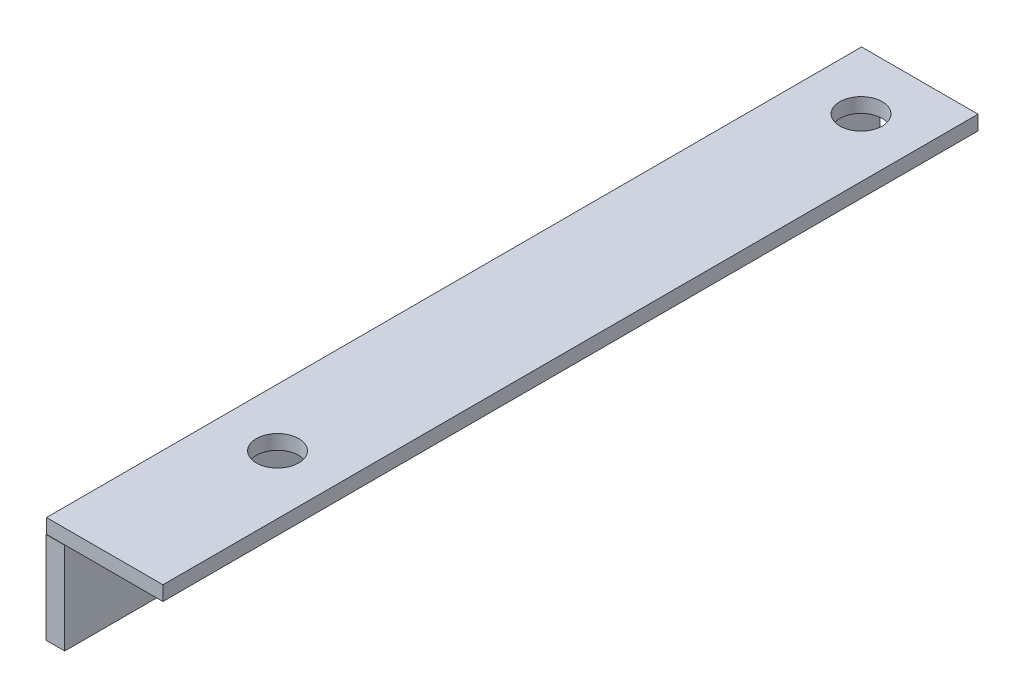
ISO-10303-21;
HEADER;
FILE_DESCRIPTION(('STEP AP214'),'2;1');
FILE_NAME('part.step','',(''),(''),'','','');
FILE_SCHEMA(('AUTOMOTIVE_DESIGN { 1 0 10303 214 1 1 1 1 }'));
ENDSEC;
DATA;
#1=APPLICATION_CONTEXT('core data for automotive mechanical design processes');
#2=APPLICATION_PROTOCOL_DEFINITION('international standard','automotive_design',2000,#1);
#3=PRODUCT_CONTEXT('',#1,'mechanical');
#4=PRODUCT('Part','Part','',(#3));
#5=PRODUCT_RELATED_PRODUCT_CATEGORY('part','',(#4));
#6=PRODUCT_DEFINITION_FORMATION('','',#4);
#7=PRODUCT_DEFINITION_CONTEXT('part definition',#1,'design');
#8=PRODUCT_DEFINITION('design','',#6,#7);
#9=PRODUCT_DEFINITION_SHAPE('','',#8);
#10=(LENGTH_UNIT() NAMED_UNIT(*) SI_UNIT(.MILLI.,.METRE.));
#11=(NAMED_UNIT(*) PLANE_ANGLE_UNIT() SI_UNIT($,.RADIAN.));
#12=(NAMED_UNIT(*) SI_UNIT($,.STERADIAN.) SOLID_ANGLE_UNIT());
#13=UNCERTAINTY_MEASURE_WITH_UNIT(LENGTH_MEASURE(1.E-05),#10,'distance_accuracy_value','');
#14=(GEOMETRIC_REPRESENTATION_CONTEXT(3) GLOBAL_UNCERTAINTY_ASSIGNED_CONTEXT((#13)) GLOBAL_UNIT_ASSIGNED_CONTEXT((#10,
#11,#12)) REPRESENTATION_CONTEXT('',''));
#15=CARTESIAN_POINT('',(0.,0.,0.));
#16=DIRECTION('',(0.,0.,1.));
#17=DIRECTION('',(1.,0.,0.));
#18=AXIS2_PLACEMENT_3D('',#15,#16,#17);
#19=CARTESIAN_POINT('',(0.,0.,0.));
#20=DIRECTION('',(0.,1.,0.));
#21=DIRECTION('',(0.,0.,1.));
#22=AXIS2_PLACEMENT_3D('',#19,#20,#21);
#23=PLANE('',#22);
#24=CARTESIAN_POINT('',(6.29321488132706,0.,-31.5375424257115));
#25=DIRECTION('',(0.,1.,0.));
#26=DIRECTION('',(0.,0.,1.));
#27=AXIS2_PLACEMENT_3D('',#24,#25,#26);
#28=CIRCLE('',#27,2.31);
#29=CARTESIAN_POINT('',(6.29321488132706,0.,-29.2275424257115));
#30=VERTEX_POINT('',#29);
#31=EDGE_CURVE('E138',#30,#30,#28,.T.);
#32=ORIENTED_EDGE('',*,*,#31,.T.);
#33=EDGE_LOOP('',(#32));
#34=FACE_BOUND('',#33,.T.);
#35=CARTESIAN_POINT('',(6.29321488132639,0.,-95.1875424257115));
#36=DIRECTION('',(0.,1.,0.));
#37=DIRECTION('',(0.,0.,1.));
#38=AXIS2_PLACEMENT_3D('',#35,#36,#37);
#39=CIRCLE('',#38,2.31);
#40=CARTESIAN_POINT('',(6.29321488132639,0.,-92.8775424257115));
#41=VERTEX_POINT('',#40);
#42=EDGE_CURVE('E148',#41,#41,#39,.T.);
#43=ORIENTED_EDGE('',*,*,#42,.T.);
#44=EDGE_LOOP('',(#43));
#45=FACE_BOUND('',#44,.T.);
#46=DIRECTION('',(0.,0.,1.));
#47=VECTOR('',#46,1.);
#48=CARTESIAN_POINT('',(2.01860449322074,0.,-12.6020869911836));
#49=LINE('',#48,#47);
#50=CARTESIAN_POINT('',(2.01860449322074,0.,-101.537542425712));
#51=VERTEX_POINT('',#50);
#52=CARTESIAN_POINT('',(2.01860449322074,0.,-12.6375424257115));
#53=VERTEX_POINT('',#52);
#54=EDGE_CURVE('E50',#51,#53,#49,.T.);
#55=ORIENTED_EDGE('',*,*,#54,.F.);
#56=DIRECTION('',(-1.,0.,0.));
#57=VECTOR('',#56,1.);
#58=CARTESIAN_POINT('',(0.,0.,-101.537542425712));
#59=LINE('',#58,#57);
#60=CARTESIAN_POINT('',(12.7,0.,-101.537542425712));
#61=VERTEX_POINT('',#60);
#62=EDGE_CURVE('E158',#61,#51,#59,.T.);
#63=ORIENTED_EDGE('',*,*,#62,.F.);
#64=DIRECTION('',(0.,0.,-1.));
#65=VECTOR('',#64,1.);
#66=CARTESIAN_POINT('',(12.7,0.,-101.537542425712));
#67=LINE('',#66,#65);
#68=CARTESIAN_POINT('',(12.7,0.,-12.6375424257115));
#69=VERTEX_POINT('',#68);
#70=EDGE_CURVE('E167',#69,#61,#67,.T.);
#71=ORIENTED_EDGE('',*,*,#70,.F.);
#72=DIRECTION('',(1.,0.,0.));
#73=VECTOR('',#72,1.);
#74=CARTESIAN_POINT('',(0.,0.,-12.6375424257115));
#75=LINE('',#74,#73);
#76=EDGE_CURVE('E164',#53,#69,#75,.T.);
#77=ORIENTED_EDGE('',*,*,#76,.F.);
#78=EDGE_LOOP('',(#55,#63,#71,#77));
#79=FACE_BOUND('',#78,.T.);
#80=ADVANCED_FACE('F35',(#34,#45,#79),#23,.F.);
#81=CARTESIAN_POINT('',(0.,1.5875,0.));
#82=DIRECTION('',(0.,1.,0.));
#83=DIRECTION('',(0.,0.,1.));
#84=AXIS2_PLACEMENT_3D('',#81,#82,#83);
#85=PLANE('',#84);
#86=CARTESIAN_POINT('',(6.29321488132639,1.5875,-95.1875424257115));
#87=DIRECTION('',(0.,1.,0.));
#88=DIRECTION('',(0.,0.,1.));
#89=AXIS2_PLACEMENT_3D('',#86,#87,#88);
#90=CIRCLE('',#89,2.31);
#91=CARTESIAN_POINT('',(6.29321488132639,1.5875,-92.8775424257115));
#92=VERTEX_POINT('',#91);
#93=EDGE_CURVE('E150',#92,#92,#90,.T.);
#94=ORIENTED_EDGE('',*,*,#93,.F.);
#95=EDGE_LOOP('',(#94));
#96=FACE_BOUND('',#95,.T.);
#97=DIRECTION('',(0.,0.,1.));
#98=VECTOR('',#97,1.);
#99=CARTESIAN_POINT('',(0.,1.5875,-101.537542425712));
#100=LINE('',#99,#98);
#101=CARTESIAN_POINT('',(0.,1.5875,-101.537542425712));
#102=VERTEX_POINT('',#101);
#103=CARTESIAN_POINT('',(0.,1.5875,-12.6375424257115));
#104=VERTEX_POINT('',#103);
#105=EDGE_CURVE('E156',#102,#104,#100,.T.);
#106=ORIENTED_EDGE('',*,*,#105,.T.);
#107=DIRECTION('',(1.,0.,0.));
#108=VECTOR('',#107,1.);
#109=CARTESIAN_POINT('',(0.,1.5875,-12.6375424257115));
#110=LINE('',#109,#108);
#111=CARTESIAN_POINT('',(12.7,1.5875,-12.6375424257115));
#112=VERTEX_POINT('',#111);
#113=EDGE_CURVE('E86',#104,#112,#110,.T.);
#114=ORIENTED_EDGE('',*,*,#113,.T.);
#115=DIRECTION('',(0.,0.,-1.));
#116=VECTOR('',#115,1.);
#117=CARTESIAN_POINT('',(12.7,1.5875,-101.537542425712));
#118=LINE('',#117,#116);
#119=CARTESIAN_POINT('',(12.7,1.5875,-101.537542425712));
#120=VERTEX_POINT('',#119);
#121=EDGE_CURVE('E160',#112,#120,#118,.T.);
#122=ORIENTED_EDGE('',*,*,#121,.T.);
#123=DIRECTION('',(-1.,0.,0.));
#124=VECTOR('',#123,1.);
#125=CARTESIAN_POINT('',(0.,1.5875,-101.537542425712));
#126=LINE('',#125,#124);
#127=EDGE_CURVE('E59',#120,#102,#126,.T.);
#128=ORIENTED_EDGE('',*,*,#127,.T.);
#129=EDGE_LOOP('',(#106,#114,#122,#128));
#130=FACE_BOUND('',#129,.T.);
#131=CARTESIAN_POINT('',(6.29321488132706,1.5875,-31.5375424257115));
#132=DIRECTION('',(0.,1.,0.));
#133=DIRECTION('',(0.,0.,1.));
#134=AXIS2_PLACEMENT_3D('',#131,#132,#133);
#135=CIRCLE('',#134,2.31);
#136=CARTESIAN_POINT('',(6.29321488132706,1.5875,-29.2275424257115));
#137=VERTEX_POINT('',#136);
#138=EDGE_CURVE('E141',#137,#137,#135,.T.);
#139=ORIENTED_EDGE('',*,*,#138,.F.);
#140=EDGE_LOOP('',(#139));
#141=FACE_BOUND('',#140,.T.);
#142=ADVANCED_FACE('F209',(#96,#130,#141),#85,.T.);
#143=CARTESIAN_POINT('',(0.,1.5875,-101.537542425712));
#144=DIRECTION('',(1.,0.,0.));
#145=DIRECTION('',(0.,0.,-1.));
#146=AXIS2_PLACEMENT_3D('',#143,#144,#145);
#147=PLANE('',#146);
#148=DIRECTION('',(0.,0.,1.));
#149=VECTOR('',#148,1.);
#150=CARTESIAN_POINT('',(0.,0.,-101.537542425712));
#151=LINE('',#150,#149);
#152=CARTESIAN_POINT('',(0.,0.,-101.537542425712));
#153=VERTEX_POINT('',#152);
#154=CARTESIAN_POINT('',(0.,0.,-12.6375424257115));
#155=VERTEX_POINT('',#154);
#156=EDGE_CURVE('E153',#153,#155,#151,.T.);
#157=ORIENTED_EDGE('',*,*,#156,.T.);
#158=DIRECTION('',(0.,-1.,0.));
#159=VECTOR('',#158,1.);
#160=CARTESIAN_POINT('',(0.,1.5875,-12.6375424257115));
#161=LINE('',#160,#159);
#162=EDGE_CURVE('E11',#104,#155,#161,.T.);
#163=ORIENTED_EDGE('',*,*,#162,.F.);
#164=ORIENTED_EDGE('',*,*,#105,.F.);
#165=DIRECTION('',(0.,-1.,0.));
#166=VECTOR('',#165,1.);
#167=CARTESIAN_POINT('',(0.,1.5875,-101.537542425712));
#168=LINE('',#167,#166);
#169=EDGE_CURVE('E79',#102,#153,#168,.T.);
#170=ORIENTED_EDGE('',*,*,#169,.T.);
#171=EDGE_LOOP('',(#157,#163,#164,#170));
#172=FACE_BOUND('',#171,.T.);
#173=ADVANCED_FACE('F37',(#172),#147,.F.);
#174=CARTESIAN_POINT('',(0.,1.5875,-12.6375424257115));
#175=DIRECTION('',(0.,0.,-1.));
#176=DIRECTION('',(-1.,0.,0.));
#177=AXIS2_PLACEMENT_3D('',#174,#175,#176);
#178=PLANE('',#177);
#179=EDGE_CURVE('E165',#155,#53,#75,.T.);
#180=ORIENTED_EDGE('',*,*,#179,.T.);
#181=ORIENTED_EDGE('',*,*,#76,.T.);
#182=DIRECTION('',(0.,-1.,0.));
#183=VECTOR('',#182,1.);
#184=CARTESIAN_POINT('',(12.7,1.5875,-12.6375424257115));
#185=LINE('',#184,#183);
#186=EDGE_CURVE('E43',#112,#69,#185,.T.);
#187=ORIENTED_EDGE('',*,*,#186,.F.);
#188=ORIENTED_EDGE('',*,*,#113,.F.);
#189=ORIENTED_EDGE('',*,*,#162,.T.);
#190=EDGE_LOOP('',(#180,#181,#187,#188,#189));
#191=FACE_BOUND('',#190,.T.);
#192=ADVANCED_FACE('F202',(#191),#178,.F.);
#193=CARTESIAN_POINT('',(12.7,1.5875,-101.537542425712));
#194=DIRECTION('',(-1.,0.,0.));
#195=DIRECTION('',(0.,0.,1.));
#196=AXIS2_PLACEMENT_3D('',#193,#194,#195);
#197=PLANE('',#196);
#198=ORIENTED_EDGE('',*,*,#70,.T.);
#199=DIRECTION('',(0.,-1.,0.));
#200=VECTOR('',#199,1.);
#201=CARTESIAN_POINT('',(12.7,1.5875,-101.537542425712));
#202=LINE('',#201,#200);
#203=EDGE_CURVE('E171',#120,#61,#202,.T.);
#204=ORIENTED_EDGE('',*,*,#203,.F.);
#205=ORIENTED_EDGE('',*,*,#121,.F.);
#206=ORIENTED_EDGE('',*,*,#186,.T.);
#207=EDGE_LOOP('',(#198,#204,#205,#206));
#208=FACE_BOUND('',#207,.T.);
#209=ADVANCED_FACE('F177',(#208),#197,.F.);
#210=CARTESIAN_POINT('',(0.,1.5875,-101.537542425712));
#211=DIRECTION('',(0.,0.,1.));
#212=DIRECTION('',(1.,0.,0.));
#213=AXIS2_PLACEMENT_3D('',#210,#211,#212);
#214=PLANE('',#213);
#215=ORIENTED_EDGE('',*,*,#62,.T.);
#216=DIRECTION('',(0.,1.,0.));
#217=VECTOR('',#216,1.);
#218=CARTESIAN_POINT('',(2.01860449322074,-10.,-101.537542425712));
#219=LINE('',#218,#217);
#220=CARTESIAN_POINT('',(2.01860449322074,-10.,-101.537542425712));
#221=VERTEX_POINT('',#220);
#222=EDGE_CURVE('E181',#221,#51,#219,.T.);
#223=ORIENTED_EDGE('',*,*,#222,.F.);
#224=DIRECTION('',(1.,0.,0.));
#225=VECTOR('',#224,1.);
#226=CARTESIAN_POINT('',(2.01860449322074,-10.,-101.537542425712));
#227=LINE('',#226,#225);
#228=CARTESIAN_POINT('',(-0.0200563906815887,-10.,-101.537542425712));
#229=VERTEX_POINT('',#228);
#230=EDGE_CURVE('E128',#229,#221,#227,.T.);
#231=ORIENTED_EDGE('',*,*,#230,.F.);
#232=DIRECTION('',(0.,1.,0.));
#233=VECTOR('',#232,1.);
#234=CARTESIAN_POINT('',(-0.0200563906815887,-10.,-101.537542425712));
#235=LINE('',#234,#233);
#236=CARTESIAN_POINT('',(-0.0200563906815887,0.,-101.537542425712));
#237=VERTEX_POINT('',#236);
#238=EDGE_CURVE('E143',#229,#237,#235,.T.);
#239=ORIENTED_EDGE('',*,*,#238,.T.);
#240=DIRECTION('',(1.,0.,0.));
#241=VECTOR('',#240,1.);
#242=CARTESIAN_POINT('',(2.01860449322074,0.,-101.537542425712));
#243=LINE('',#242,#241);
#244=EDGE_CURVE('E132',#237,#153,#243,.T.);
#245=ORIENTED_EDGE('',*,*,#244,.T.);
#246=ORIENTED_EDGE('',*,*,#169,.F.);
#247=ORIENTED_EDGE('',*,*,#127,.F.);
#248=ORIENTED_EDGE('',*,*,#203,.T.);
#249=EDGE_LOOP('',(#215,#223,#231,#239,#245,#246,#247,#248));
#250=FACE_BOUND('',#249,.T.);
#251=ADVANCED_FACE('F180',(#250),#214,.F.);
#252=CARTESIAN_POINT('',(6.29321488132639,1.5875,-95.1875424257115));
#253=DIRECTION('',(0.,-1.,0.));
#254=DIRECTION('',(0.,0.,-1.));
#255=AXIS2_PLACEMENT_3D('',#252,#253,#254);
#256=CYLINDRICAL_SURFACE('',#255,2.31);
#257=ORIENTED_EDGE('',*,*,#93,.T.);
#258=EDGE_LOOP('',(#257));
#259=FACE_BOUND('',#258,.T.);
#260=ORIENTED_EDGE('',*,*,#42,.F.);
#261=EDGE_LOOP('',(#260));
#262=FACE_BOUND('',#261,.T.);
#263=ADVANCED_FACE('F222',(#259,#262),#256,.F.);
#264=CARTESIAN_POINT('',(6.29321488132706,1.5875,-31.5375424257115));
#265=DIRECTION('',(0.,-1.,0.));
#266=DIRECTION('',(0.,0.,-1.));
#267=AXIS2_PLACEMENT_3D('',#264,#265,#266);
#268=CYLINDRICAL_SURFACE('',#267,2.31);
#269=ORIENTED_EDGE('',*,*,#138,.T.);
#270=EDGE_LOOP('',(#269));
#271=FACE_BOUND('',#270,.T.);
#272=ORIENTED_EDGE('',*,*,#31,.F.);
#273=EDGE_LOOP('',(#272));
#274=FACE_BOUND('',#273,.T.);
#275=ADVANCED_FACE('F226',(#271,#274),#268,.F.);
#276=CARTESIAN_POINT('',(0.,0.,0.));
#277=DIRECTION('',(0.,1.,0.));
#278=DIRECTION('',(0.,0.,1.));
#279=AXIS2_PLACEMENT_3D('',#276,#277,#278);
#280=PLANE('',#279);
#281=ORIENTED_EDGE('',*,*,#156,.F.);
#282=ORIENTED_EDGE('',*,*,#244,.F.);
#283=DIRECTION('',(0.,0.,-1.));
#284=VECTOR('',#283,1.);
#285=CARTESIAN_POINT('',(-0.0200563906815887,0.,-12.6020869911836));
#286=LINE('',#285,#284);
#287=CARTESIAN_POINT('',(-0.0200563906815887,0.,-12.6020869911836));
#288=VERTEX_POINT('',#287);
#289=EDGE_CURVE('E188',#288,#237,#286,.T.);
#290=ORIENTED_EDGE('',*,*,#289,.F.);
#291=DIRECTION('',(-1.,0.,0.));
#292=VECTOR('',#291,1.);
#293=CARTESIAN_POINT('',(2.01860449322074,0.,-12.6020869911836));
#294=LINE('',#293,#292);
#295=CARTESIAN_POINT('',(2.01860449322074,0.,-12.6020869911836));
#296=VERTEX_POINT('',#295);
#297=EDGE_CURVE('E190',#296,#288,#294,.T.);
#298=ORIENTED_EDGE('',*,*,#297,.F.);
#299=EDGE_CURVE('E136',#53,#296,#49,.T.);
#300=ORIENTED_EDGE('',*,*,#299,.F.);
#301=ORIENTED_EDGE('',*,*,#179,.F.);
#302=EDGE_LOOP('',(#281,#282,#290,#298,#300,#301));
#303=FACE_BOUND('',#302,.T.);
#304=ADVANCED_FACE('F199',(#303),#280,.T.);
#305=CARTESIAN_POINT('',(2.01860449322074,-10.,-12.6020869911836));
#306=DIRECTION('',(-1.,0.,0.));
#307=DIRECTION('',(0.,0.,1.));
#308=AXIS2_PLACEMENT_3D('',#305,#306,#307);
#309=PLANE('',#308);
#310=ORIENTED_EDGE('',*,*,#54,.T.);
#311=ORIENTED_EDGE('',*,*,#299,.T.);
#312=DIRECTION('',(0.,1.,0.));
#313=VECTOR('',#312,1.);
#314=CARTESIAN_POINT('',(2.01860449322074,-10.,-12.6020869911836));
#315=LINE('',#314,#313);
#316=CARTESIAN_POINT('',(2.01860449322074,-10.,-12.6020869911836));
#317=VERTEX_POINT('',#316);
#318=EDGE_CURVE('E117',#317,#296,#315,.T.);
#319=ORIENTED_EDGE('',*,*,#318,.F.);
#320=DIRECTION('',(0.,0.,1.));
#321=VECTOR('',#320,1.);
#322=CARTESIAN_POINT('',(2.01860449322074,-10.,-12.6020869911836));
#323=LINE('',#322,#321);
#324=EDGE_CURVE('E123',#221,#317,#323,.T.);
#325=ORIENTED_EDGE('',*,*,#324,.F.);
#326=ORIENTED_EDGE('',*,*,#222,.T.);
#327=EDGE_LOOP('',(#310,#311,#319,#325,#326));
#328=FACE_BOUND('',#327,.T.);
#329=ADVANCED_FACE('F134',(#328),#309,.F.);
#330=CARTESIAN_POINT('',(2.01860449322074,-10.,-12.6020869911836));
#331=DIRECTION('',(0.,0.,-1.));
#332=DIRECTION('',(-1.,0.,0.));
#333=AXIS2_PLACEMENT_3D('',#330,#331,#332);
#334=PLANE('',#333);
#335=ORIENTED_EDGE('',*,*,#297,.T.);
#336=DIRECTION('',(0.,1.,0.));
#337=VECTOR('',#336,1.);
#338=CARTESIAN_POINT('',(-0.0200563906815887,-10.,-12.6020869911836));
#339=LINE('',#338,#337);
#340=CARTESIAN_POINT('',(-0.0200563906815887,-10.,-12.6020869911836));
#341=VERTEX_POINT('',#340);
#342=EDGE_CURVE('E119',#341,#288,#339,.T.);
#343=ORIENTED_EDGE('',*,*,#342,.F.);
#344=DIRECTION('',(-1.,0.,0.));
#345=VECTOR('',#344,1.);
#346=CARTESIAN_POINT('',(2.01860449322074,-10.,-12.6020869911836));
#347=LINE('',#346,#345);
#348=EDGE_CURVE('E113',#317,#341,#347,.T.);
#349=ORIENTED_EDGE('',*,*,#348,.F.);
#350=ORIENTED_EDGE('',*,*,#318,.T.);
#351=EDGE_LOOP('',(#335,#343,#349,#350));
#352=FACE_BOUND('',#351,.T.);
#353=ADVANCED_FACE('F115',(#352),#334,.F.);
#354=CARTESIAN_POINT('',(-0.0200563906815887,-10.,-12.6020869911836));
#355=DIRECTION('',(1.,0.,0.));
#356=DIRECTION('',(0.,0.,-1.));
#357=AXIS2_PLACEMENT_3D('',#354,#355,#356);
#358=PLANE('',#357);
#359=ORIENTED_EDGE('',*,*,#289,.T.);
#360=ORIENTED_EDGE('',*,*,#238,.F.);
#361=DIRECTION('',(0.,0.,-1.));
#362=VECTOR('',#361,1.);
#363=CARTESIAN_POINT('',(-0.0200563906815887,-10.,-12.6020869911836));
#364=LINE('',#363,#362);
#365=EDGE_CURVE('E122',#341,#229,#364,.T.);
#366=ORIENTED_EDGE('',*,*,#365,.F.);
#367=ORIENTED_EDGE('',*,*,#342,.T.);
#368=EDGE_LOOP('',(#359,#360,#366,#367));
#369=FACE_BOUND('',#368,.T.);
#370=ADVANCED_FACE('F195',(#369),#358,.F.);
#371=CARTESIAN_POINT('',(0.,-10.,0.));
#372=DIRECTION('',(0.,1.,0.));
#373=DIRECTION('',(0.,0.,1.));
#374=AXIS2_PLACEMENT_3D('',#371,#372,#373);
#375=PLANE('',#374);
#376=ORIENTED_EDGE('',*,*,#324,.T.);
#377=ORIENTED_EDGE('',*,*,#348,.T.);
#378=ORIENTED_EDGE('',*,*,#365,.T.);
#379=ORIENTED_EDGE('',*,*,#230,.T.);
#380=EDGE_LOOP('',(#376,#377,#378,#379));
#381=FACE_BOUND('',#380,.T.);
#382=ADVANCED_FACE('F126',(#381),#375,.F.);
#383=CLOSED_SHELL('',(#80,#142,#173,#192,#209,#251,#263,#275,#304,#329,#353,#370,#382));
#384=MANIFOLD_SOLID_BREP('B2',#383);
#385=ADVANCED_BREP_SHAPE_REPRESENTATION('',(#18,#384),#14);
#386=SHAPE_DEFINITION_REPRESENTATION(#9,#385);
ENDSEC;
END-ISO-10303-21;
